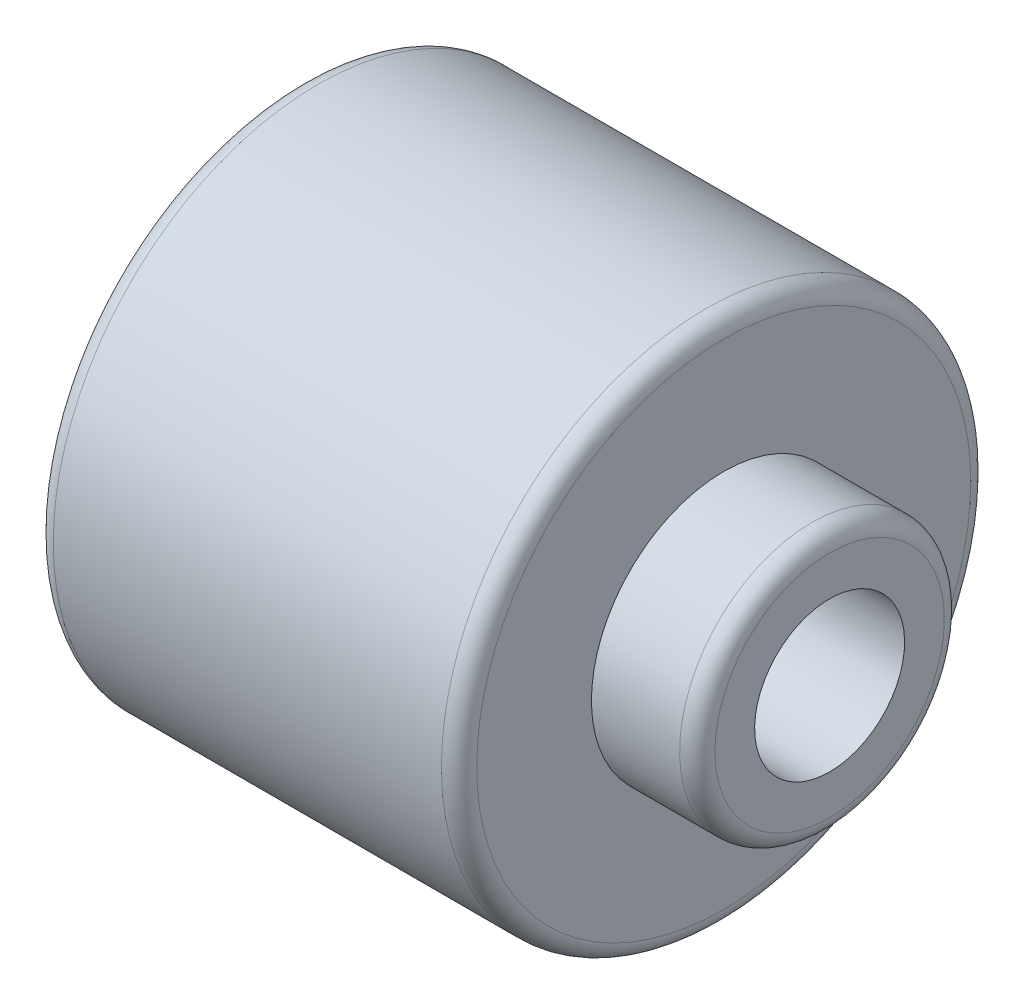
ISO-10303-21;
HEADER;
FILE_DESCRIPTION(('STEP AP214'),'2;1');
FILE_NAME('part.step','',(''),(''),'','','');
FILE_SCHEMA(('AUTOMOTIVE_DESIGN { 1 0 10303 214 1 1 1 1 }'));
ENDSEC;
DATA;
#1=APPLICATION_CONTEXT('core data for automotive mechanical design processes');
#2=APPLICATION_PROTOCOL_DEFINITION('international standard','automotive_design',2000,#1);
#3=PRODUCT_CONTEXT('',#1,'mechanical');
#4=PRODUCT('Part','Part','',(#3));
#5=PRODUCT_RELATED_PRODUCT_CATEGORY('part','',(#4));
#6=PRODUCT_DEFINITION_FORMATION('','',#4);
#7=PRODUCT_DEFINITION_CONTEXT('part definition',#1,'design');
#8=PRODUCT_DEFINITION('design','',#6,#7);
#9=PRODUCT_DEFINITION_SHAPE('','',#8);
#10=(LENGTH_UNIT() NAMED_UNIT(*) SI_UNIT(.MILLI.,.METRE.));
#11=(NAMED_UNIT(*) PLANE_ANGLE_UNIT() SI_UNIT($,.RADIAN.));
#12=(NAMED_UNIT(*) SI_UNIT($,.STERADIAN.) SOLID_ANGLE_UNIT());
#13=UNCERTAINTY_MEASURE_WITH_UNIT(LENGTH_MEASURE(1.E-05),#10,'distance_accuracy_value','');
#14=(GEOMETRIC_REPRESENTATION_CONTEXT(3) GLOBAL_UNCERTAINTY_ASSIGNED_CONTEXT((#13)) GLOBAL_UNIT_ASSIGNED_CONTEXT((#10,
#11,#12)) REPRESENTATION_CONTEXT('',''));
#15=CARTESIAN_POINT('',(0.,0.,0.));
#16=DIRECTION('',(0.,0.,1.));
#17=DIRECTION('',(1.,0.,0.));
#18=AXIS2_PLACEMENT_3D('',#15,#16,#17);
#19=CARTESIAN_POINT('',(0.,0.,0.));
#20=DIRECTION('',(-1.,0.,0.));
#21=DIRECTION('',(0.,-1.,0.));
#22=AXIS2_PLACEMENT_3D('',#19,#20,#21);
#23=PLANE('',#22);
#24=CARTESIAN_POINT('',(0.,0.,0.));
#25=DIRECTION('',(-1.,0.,0.));
#26=DIRECTION('',(0.,-1.,0.));
#27=AXIS2_PLACEMENT_3D('',#24,#25,#26);
#28=CIRCLE('',#27,14.);
#29=CARTESIAN_POINT('',(0.,-14.,0.));
#30=VERTEX_POINT('',#29);
#31=EDGE_CURVE('E43',#30,#30,#28,.T.);
#32=ORIENTED_EDGE('',*,*,#31,.T.);
#33=EDGE_LOOP('',(#32));
#34=FACE_BOUND('',#33,.T.);
#35=CARTESIAN_POINT('',(0.,0.,0.));
#36=DIRECTION('',(-1.,0.,0.));
#37=DIRECTION('',(0.,-1.,0.));
#38=AXIS2_PLACEMENT_3D('',#35,#36,#37);
#39=CIRCLE('',#38,4.25);
#40=CARTESIAN_POINT('',(0.,-4.25,0.));
#41=VERTEX_POINT('',#40);
#42=EDGE_CURVE('E66',#41,#41,#39,.T.);
#43=ORIENTED_EDGE('',*,*,#42,.F.);
#44=EDGE_LOOP('',(#43));
#45=FACE_BOUND('',#44,.T.);
#46=ADVANCED_FACE('F36',(#34,#45),#23,.T.);
#47=CARTESIAN_POINT('',(30.,0.,0.));
#48=DIRECTION('',(1.,0.,0.));
#49=DIRECTION('',(0.,1.,0.));
#50=AXIS2_PLACEMENT_3D('',#47,#48,#49);
#51=CYLINDRICAL_SURFACE('',#50,15.);
#52=CARTESIAN_POINT('',(1.,0.,0.));
#53=DIRECTION('',(-1.,0.,0.));
#54=DIRECTION('',(0.,-1.,0.));
#55=AXIS2_PLACEMENT_3D('',#52,#53,#54);
#56=CIRCLE('',#55,15.);
#57=CARTESIAN_POINT('',(1.,-15.,0.));
#58=VERTEX_POINT('',#57);
#59=EDGE_CURVE('E47',#58,#58,#56,.F.);
#60=ORIENTED_EDGE('',*,*,#59,.T.);
#61=EDGE_LOOP('',(#60));
#62=FACE_BOUND('',#61,.T.);
#63=CARTESIAN_POINT('',(23.,0.,0.));
#64=DIRECTION('',(1.,0.,0.));
#65=DIRECTION('',(0.,1.,0.));
#66=AXIS2_PLACEMENT_3D('',#63,#64,#65);
#67=CIRCLE('',#66,15.);
#68=CARTESIAN_POINT('',(23.,15.,0.));
#69=VERTEX_POINT('',#68);
#70=EDGE_CURVE('E51',#69,#69,#67,.F.);
#71=ORIENTED_EDGE('',*,*,#70,.T.);
#72=EDGE_LOOP('',(#71));
#73=FACE_BOUND('',#72,.T.);
#74=ADVANCED_FACE('F82',(#62,#73),#51,.T.);
#75=CARTESIAN_POINT('',(24.,15.,0.));
#76=DIRECTION('',(1.,0.,0.));
#77=DIRECTION('',(0.,1.,0.));
#78=AXIS2_PLACEMENT_3D('',#75,#76,#77);
#79=PLANE('',#78);
#80=CARTESIAN_POINT('',(24.,0.,0.));
#81=DIRECTION('',(1.,0.,0.));
#82=DIRECTION('',(0.,1.,0.));
#83=AXIS2_PLACEMENT_3D('',#80,#81,#82);
#84=CIRCLE('',#83,14.);
#85=CARTESIAN_POINT('',(24.,14.,0.));
#86=VERTEX_POINT('',#85);
#87=EDGE_CURVE('E10',#86,#86,#84,.T.);
#88=ORIENTED_EDGE('',*,*,#87,.T.);
#89=EDGE_LOOP('',(#88));
#90=FACE_BOUND('',#89,.T.);
#91=CARTESIAN_POINT('',(24.,0.,0.));
#92=DIRECTION('',(1.,0.,0.));
#93=DIRECTION('',(0.,1.,0.));
#94=AXIS2_PLACEMENT_3D('',#91,#92,#93);
#95=CIRCLE('',#94,7.5);
#96=CARTESIAN_POINT('',(24.,7.5,0.));
#97=VERTEX_POINT('',#96);
#98=EDGE_CURVE('E62',#97,#97,#95,.T.);
#99=ORIENTED_EDGE('',*,*,#98,.F.);
#100=EDGE_LOOP('',(#99));
#101=FACE_BOUND('',#100,.T.);
#102=ADVANCED_FACE('F87',(#90,#101),#79,.T.);
#103=CARTESIAN_POINT('',(30.,0.,0.));
#104=DIRECTION('',(1.,0.,0.));
#105=DIRECTION('',(0.,1.,0.));
#106=AXIS2_PLACEMENT_3D('',#103,#104,#105);
#107=CYLINDRICAL_SURFACE('',#106,7.5);
#108=CARTESIAN_POINT('',(29.,0.,0.));
#109=DIRECTION('',(1.,0.,0.));
#110=DIRECTION('',(0.,1.,0.));
#111=AXIS2_PLACEMENT_3D('',#108,#109,#110);
#112=CIRCLE('',#111,7.5);
#113=CARTESIAN_POINT('',(29.,7.5,0.));
#114=VERTEX_POINT('',#113);
#115=EDGE_CURVE('E56',#114,#114,#112,.F.);
#116=ORIENTED_EDGE('',*,*,#115,.T.);
#117=EDGE_LOOP('',(#116));
#118=FACE_BOUND('',#117,.T.);
#119=ORIENTED_EDGE('',*,*,#98,.T.);
#120=EDGE_LOOP('',(#119));
#121=FACE_BOUND('',#120,.T.);
#122=ADVANCED_FACE('F128',(#118,#121),#107,.T.);
#123=CARTESIAN_POINT('',(30.,7.5,0.));
#124=DIRECTION('',(1.,0.,0.));
#125=DIRECTION('',(0.,1.,0.));
#126=AXIS2_PLACEMENT_3D('',#123,#124,#125);
#127=PLANE('',#126);
#128=CARTESIAN_POINT('',(30.,0.,0.));
#129=DIRECTION('',(1.,0.,0.));
#130=DIRECTION('',(0.,1.,0.));
#131=AXIS2_PLACEMENT_3D('',#128,#129,#130);
#132=CIRCLE('',#131,6.5);
#133=CARTESIAN_POINT('',(30.,6.5,0.));
#134=VERTEX_POINT('',#133);
#135=EDGE_CURVE('E59',#134,#134,#132,.T.);
#136=ORIENTED_EDGE('',*,*,#135,.T.);
#137=EDGE_LOOP('',(#136));
#138=FACE_BOUND('',#137,.T.);
#139=CARTESIAN_POINT('',(30.,0.,0.));
#140=DIRECTION('',(-1.,0.,0.));
#141=DIRECTION('',(0.,-1.,0.));
#142=AXIS2_PLACEMENT_3D('',#139,#140,#141);
#143=CIRCLE('',#142,4.25);
#144=CARTESIAN_POINT('',(30.,-4.25,0.));
#145=VERTEX_POINT('',#144);
#146=EDGE_CURVE('E65',#145,#145,#143,.T.);
#147=ORIENTED_EDGE('',*,*,#146,.T.);
#148=EDGE_LOOP('',(#147));
#149=FACE_BOUND('',#148,.T.);
#150=ADVANCED_FACE('F72',(#138,#149),#127,.T.);
#151=CARTESIAN_POINT('',(30.,0.,0.));
#152=DIRECTION('',(-1.,0.,0.));
#153=DIRECTION('',(0.,-1.,0.));
#154=AXIS2_PLACEMENT_3D('',#151,#152,#153);
#155=CYLINDRICAL_SURFACE('',#154,4.25);
#156=ORIENTED_EDGE('',*,*,#146,.F.);
#157=EDGE_LOOP('',(#156));
#158=FACE_BOUND('',#157,.T.);
#159=ORIENTED_EDGE('',*,*,#42,.T.);
#160=EDGE_LOOP('',(#159));
#161=FACE_BOUND('',#160,.T.);
#162=ADVANCED_FACE('F74',(#158,#161),#155,.F.);
#163=CARTESIAN_POINT('',(29.,0.,0.));
#164=DIRECTION('',(1.,0.,0.));
#165=DIRECTION('',(0.,1.,0.));
#166=AXIS2_PLACEMENT_3D('',#163,#164,#165);
#167=TOROIDAL_SURFACE('',#166,6.5,1.);
#168=ORIENTED_EDGE('',*,*,#115,.F.);
#169=EDGE_LOOP('',(#168));
#170=FACE_BOUND('',#169,.T.);
#171=ORIENTED_EDGE('',*,*,#135,.F.);
#172=EDGE_LOOP('',(#171));
#173=FACE_BOUND('',#172,.T.);
#174=ADVANCED_FACE('F77',(#170,#173),#167,.T.);
#175=CARTESIAN_POINT('',(1.,0.,0.));
#176=DIRECTION('',(-1.,0.,0.));
#177=DIRECTION('',(0.,-1.,0.));
#178=AXIS2_PLACEMENT_3D('',#175,#176,#177);
#179=TOROIDAL_SURFACE('',#178,14.,1.);
#180=ORIENTED_EDGE('',*,*,#31,.F.);
#181=EDGE_LOOP('',(#180));
#182=FACE_BOUND('',#181,.T.);
#183=ORIENTED_EDGE('',*,*,#59,.F.);
#184=EDGE_LOOP('',(#183));
#185=FACE_BOUND('',#184,.T.);
#186=ADVANCED_FACE('F93',(#182,#185),#179,.T.);
#187=CARTESIAN_POINT('',(23.,0.,0.));
#188=DIRECTION('',(1.,0.,0.));
#189=DIRECTION('',(0.,1.,0.));
#190=AXIS2_PLACEMENT_3D('',#187,#188,#189);
#191=TOROIDAL_SURFACE('',#190,14.,1.);
#192=ORIENTED_EDGE('',*,*,#70,.F.);
#193=EDGE_LOOP('',(#192));
#194=FACE_BOUND('',#193,.T.);
#195=ORIENTED_EDGE('',*,*,#87,.F.);
#196=EDGE_LOOP('',(#195));
#197=FACE_BOUND('',#196,.T.);
#198=ADVANCED_FACE('F38',(#194,#197),#191,.T.);
#199=CLOSED_SHELL('',(#46,#74,#102,#122,#150,#162,#174,#186,#198));
#200=MANIFOLD_SOLID_BREP('B2',#199);
#201=ADVANCED_BREP_SHAPE_REPRESENTATION('',(#18,#200),#14);
#202=SHAPE_DEFINITION_REPRESENTATION(#9,#201);
ENDSEC;
END-ISO-10303-21;
